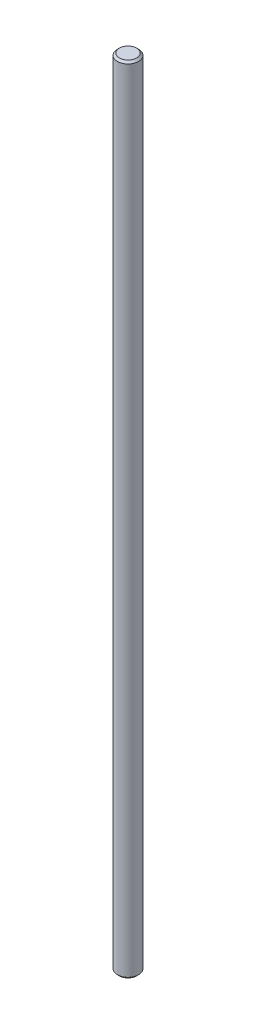
ISO-10303-21;
HEADER;
FILE_DESCRIPTION(('STEP AP214'),'2;1');
FILE_NAME('part.step','',(''),(''),'','','');
FILE_SCHEMA(('AUTOMOTIVE_DESIGN { 1 0 10303 214 1 1 1 1 }'));
ENDSEC;
DATA;
#1=APPLICATION_CONTEXT('core data for automotive mechanical design processes');
#2=APPLICATION_PROTOCOL_DEFINITION('international standard','automotive_design',2000,#1);
#3=PRODUCT_CONTEXT('',#1,'mechanical');
#4=PRODUCT('Part','Part','',(#3));
#5=PRODUCT_RELATED_PRODUCT_CATEGORY('part','',(#4));
#6=PRODUCT_DEFINITION_FORMATION('','',#4);
#7=PRODUCT_DEFINITION_CONTEXT('part definition',#1,'design');
#8=PRODUCT_DEFINITION('design','',#6,#7);
#9=PRODUCT_DEFINITION_SHAPE('','',#8);
#10=(LENGTH_UNIT() NAMED_UNIT(*) SI_UNIT(.MILLI.,.METRE.));
#11=(NAMED_UNIT(*) PLANE_ANGLE_UNIT() SI_UNIT($,.RADIAN.));
#12=(NAMED_UNIT(*) SI_UNIT($,.STERADIAN.) SOLID_ANGLE_UNIT());
#13=UNCERTAINTY_MEASURE_WITH_UNIT(LENGTH_MEASURE(1.E-05),#10,'distance_accuracy_value','');
#14=(GEOMETRIC_REPRESENTATION_CONTEXT(3) GLOBAL_UNCERTAINTY_ASSIGNED_CONTEXT((#13)) GLOBAL_UNIT_ASSIGNED_CONTEXT((#10,
#11,#12)) REPRESENTATION_CONTEXT('',''));
#15=CARTESIAN_POINT('',(0.,0.,0.));
#16=DIRECTION('',(0.,0.,1.));
#17=DIRECTION('',(1.,0.,0.));
#18=AXIS2_PLACEMENT_3D('',#15,#16,#17);
#19=CARTESIAN_POINT('',(0.,300.,0.));
#20=DIRECTION('',(0.,-1.,0.));
#21=DIRECTION('',(0.,0.,-1.));
#22=AXIS2_PLACEMENT_3D('',#19,#20,#21);
#23=CYLINDRICAL_SURFACE('',#22,4.);
#24=CARTESIAN_POINT('',(0.,0.749999999999973,0.));
#25=DIRECTION('',(0.,1.,0.));
#26=DIRECTION('',(0.,0.,1.));
#27=AXIS2_PLACEMENT_3D('',#24,#25,#26);
#28=CIRCLE('',#27,4.);
#29=CARTESIAN_POINT('',(0.,0.749999999999973,4.));
#30=VERTEX_POINT('',#29);
#31=EDGE_CURVE('E46',#30,#30,#28,.T.);
#32=ORIENTED_EDGE('',*,*,#31,.T.);
#33=EDGE_LOOP('',(#32));
#34=FACE_BOUND('',#33,.T.);
#35=CARTESIAN_POINT('',(0.,299.25,0.));
#36=DIRECTION('',(0.,1.,0.));
#37=DIRECTION('',(0.,0.,1.));
#38=AXIS2_PLACEMENT_3D('',#35,#36,#37);
#39=CIRCLE('',#38,4.);
#40=CARTESIAN_POINT('',(0.,299.25,4.));
#41=VERTEX_POINT('',#40);
#42=EDGE_CURVE('E50',#41,#41,#39,.F.);
#43=ORIENTED_EDGE('',*,*,#42,.T.);
#44=EDGE_LOOP('',(#43));
#45=FACE_BOUND('',#44,.T.);
#46=ADVANCED_FACE('F34',(#34,#45),#23,.T.);
#47=CARTESIAN_POINT('',(0.,300.,0.));
#48=DIRECTION('',(0.,1.,0.));
#49=DIRECTION('',(0.,0.,1.));
#50=AXIS2_PLACEMENT_3D('',#47,#48,#49);
#51=PLANE('',#50);
#52=CARTESIAN_POINT('',(0.,300.,0.));
#53=DIRECTION('',(0.,1.,0.));
#54=DIRECTION('',(0.,0.,1.));
#55=AXIS2_PLACEMENT_3D('',#52,#53,#54);
#56=CIRCLE('',#55,3.25000000000003);
#57=CARTESIAN_POINT('',(0.,300.,3.25000000000003));
#58=VERTEX_POINT('',#57);
#59=EDGE_CURVE('E10',#58,#58,#56,.T.);
#60=ORIENTED_EDGE('',*,*,#59,.T.);
#61=EDGE_LOOP('',(#60));
#62=FACE_BOUND('',#61,.T.);
#63=ADVANCED_FACE('F66',(#62),#51,.T.);
#64=CARTESIAN_POINT('',(0.,0.,0.));
#65=DIRECTION('',(0.,1.,0.));
#66=DIRECTION('',(0.,0.,1.));
#67=AXIS2_PLACEMENT_3D('',#64,#65,#66);
#68=PLANE('',#67);
#69=CARTESIAN_POINT('',(0.,0.,0.));
#70=DIRECTION('',(0.,1.,0.));
#71=DIRECTION('',(0.,0.,1.));
#72=AXIS2_PLACEMENT_3D('',#69,#70,#71);
#73=CIRCLE('',#72,3.25);
#74=CARTESIAN_POINT('',(0.,0.,3.25));
#75=VERTEX_POINT('',#74);
#76=EDGE_CURVE('E42',#75,#75,#73,.F.);
#77=ORIENTED_EDGE('',*,*,#76,.T.);
#78=EDGE_LOOP('',(#77));
#79=FACE_BOUND('',#78,.T.);
#80=ADVANCED_FACE('F63',(#79),#68,.F.);
#81=CARTESIAN_POINT('',(0.,0.749999999999973,0.));
#82=DIRECTION('',(0.,1.,0.));
#83=DIRECTION('',(0.,0.,1.));
#84=AXIS2_PLACEMENT_3D('',#81,#82,#83);
#85=CONICAL_SURFACE('',#84,4.,0.785398163397464);
#86=ORIENTED_EDGE('',*,*,#76,.F.);
#87=EDGE_LOOP('',(#86));
#88=FACE_BOUND('',#87,.T.);
#89=ORIENTED_EDGE('',*,*,#31,.F.);
#90=EDGE_LOOP('',(#89));
#91=FACE_BOUND('',#90,.T.);
#92=ADVANCED_FACE('F59',(#88,#91),#85,.T.);
#93=CARTESIAN_POINT('',(0.,300.,0.));
#94=DIRECTION('',(0.,-1.,0.));
#95=DIRECTION('',(0.,0.,-1.));
#96=AXIS2_PLACEMENT_3D('',#93,#94,#95);
#97=CONICAL_SURFACE('',#96,3.25000000000003,0.785398163397483);
#98=ORIENTED_EDGE('',*,*,#42,.F.);
#99=EDGE_LOOP('',(#98));
#100=FACE_BOUND('',#99,.T.);
#101=ORIENTED_EDGE('',*,*,#59,.F.);
#102=EDGE_LOOP('',(#101));
#103=FACE_BOUND('',#102,.T.);
#104=ADVANCED_FACE('F37',(#100,#103),#97,.T.);
#105=CLOSED_SHELL('',(#46,#63,#80,#92,#104));
#106=MANIFOLD_SOLID_BREP('B2',#105);
#107=ADVANCED_BREP_SHAPE_REPRESENTATION('',(#18,#106),#14);
#108=SHAPE_DEFINITION_REPRESENTATION(#9,#107);
ENDSEC;
END-ISO-10303-21;
